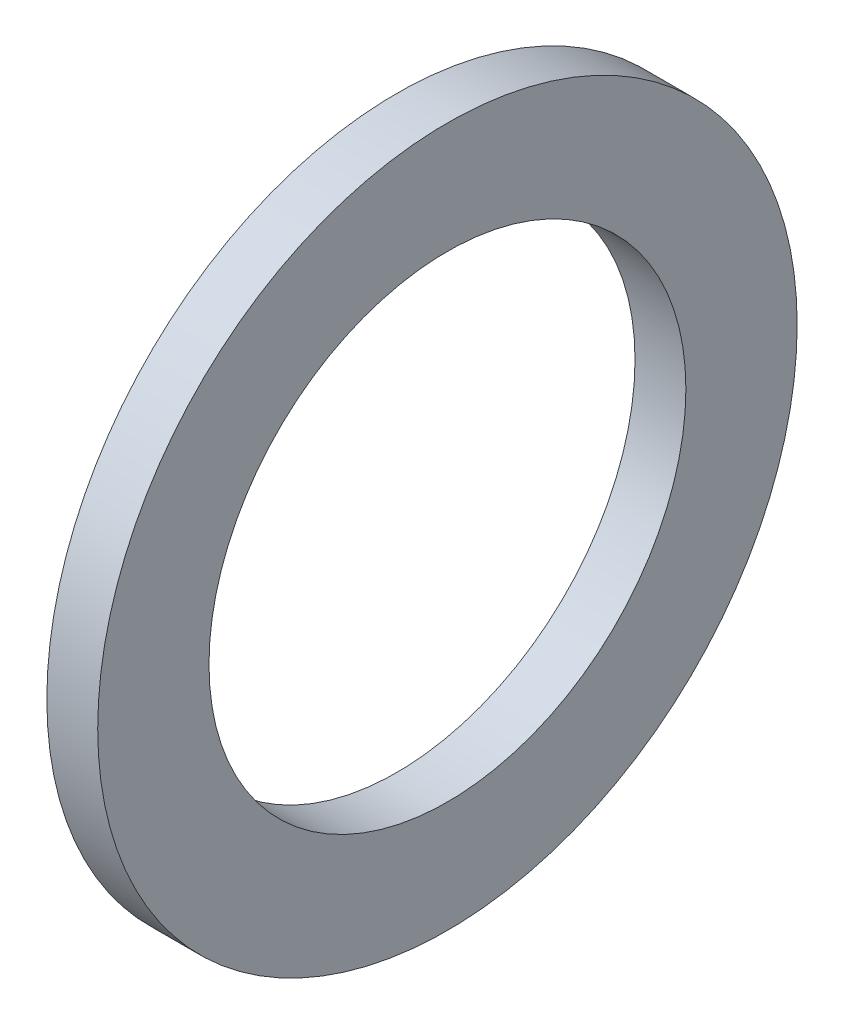
ISO-10303-21;
HEADER;
FILE_DESCRIPTION(('STEP AP214'),'2;1');
FILE_NAME('part.step','',(''),(''),'','','');
FILE_SCHEMA(('AUTOMOTIVE_DESIGN { 1 0 10303 214 1 1 1 1 }'));
ENDSEC;
DATA;
#1=APPLICATION_CONTEXT('core data for automotive mechanical design processes');
#2=APPLICATION_PROTOCOL_DEFINITION('international standard','automotive_design',2000,#1);
#3=PRODUCT_CONTEXT('',#1,'mechanical');
#4=PRODUCT('Part','Part','',(#3));
#5=PRODUCT_RELATED_PRODUCT_CATEGORY('part','',(#4));
#6=PRODUCT_DEFINITION_FORMATION('','',#4);
#7=PRODUCT_DEFINITION_CONTEXT('part definition',#1,'design');
#8=PRODUCT_DEFINITION('design','',#6,#7);
#9=PRODUCT_DEFINITION_SHAPE('','',#8);
#10=(LENGTH_UNIT() NAMED_UNIT(*) SI_UNIT(.MILLI.,.METRE.));
#11=(NAMED_UNIT(*) PLANE_ANGLE_UNIT() SI_UNIT($,.RADIAN.));
#12=(NAMED_UNIT(*) SI_UNIT($,.STERADIAN.) SOLID_ANGLE_UNIT());
#13=UNCERTAINTY_MEASURE_WITH_UNIT(LENGTH_MEASURE(1.E-05),#10,'distance_accuracy_value','');
#14=(GEOMETRIC_REPRESENTATION_CONTEXT(3) GLOBAL_UNCERTAINTY_ASSIGNED_CONTEXT((#13)) GLOBAL_UNIT_ASSIGNED_CONTEXT((#10,
#11,#12)) REPRESENTATION_CONTEXT('',''));
#15=CARTESIAN_POINT('',(0.,0.,0.));
#16=DIRECTION('',(0.,0.,1.));
#17=DIRECTION('',(1.,0.,0.));
#18=AXIS2_PLACEMENT_3D('',#15,#16,#17);
#19=CARTESIAN_POINT('',(1.6,0.,0.));
#20=DIRECTION('',(1.,0.,0.));
#21=DIRECTION('',(0.,0.,-1.));
#22=AXIS2_PLACEMENT_3D('',#19,#20,#21);
#23=PLANE('',#22);
#24=CARTESIAN_POINT('',(1.6,0.,0.));
#25=DIRECTION('',(1.,0.,0.));
#26=DIRECTION('',(0.,0.,-1.));
#27=AXIS2_PLACEMENT_3D('',#24,#25,#26);
#28=CIRCLE('',#27,11.);
#29=CARTESIAN_POINT('',(1.6,0.,-11.));
#30=VERTEX_POINT('',#29);
#31=EDGE_CURVE('E10',#30,#30,#28,.T.);
#32=ORIENTED_EDGE('',*,*,#31,.T.);
#33=EDGE_LOOP('',(#32));
#34=FACE_BOUND('',#33,.T.);
#35=CARTESIAN_POINT('',(1.6,0.,0.));
#36=DIRECTION('',(1.,0.,0.));
#37=DIRECTION('',(0.,0.,-1.));
#38=AXIS2_PLACEMENT_3D('',#35,#36,#37);
#39=CIRCLE('',#38,7.5);
#40=CARTESIAN_POINT('',(1.6,0.,-7.5));
#41=VERTEX_POINT('',#40);
#42=EDGE_CURVE('E43',#41,#41,#39,.T.);
#43=ORIENTED_EDGE('',*,*,#42,.F.);
#44=EDGE_LOOP('',(#43));
#45=FACE_BOUND('',#44,.T.);
#46=ADVANCED_FACE('F32',(#34,#45),#23,.T.);
#47=CARTESIAN_POINT('',(0.,0.,0.));
#48=DIRECTION('',(1.,0.,0.));
#49=DIRECTION('',(0.,0.,-1.));
#50=AXIS2_PLACEMENT_3D('',#47,#48,#49);
#51=PLANE('',#50);
#52=CARTESIAN_POINT('',(0.,0.,0.));
#53=DIRECTION('',(1.,0.,0.));
#54=DIRECTION('',(0.,0.,-1.));
#55=AXIS2_PLACEMENT_3D('',#52,#53,#54);
#56=CIRCLE('',#55,11.);
#57=CARTESIAN_POINT('',(0.,0.,-11.));
#58=VERTEX_POINT('',#57);
#59=EDGE_CURVE('E36',#58,#58,#56,.T.);
#60=ORIENTED_EDGE('',*,*,#59,.F.);
#61=EDGE_LOOP('',(#60));
#62=FACE_BOUND('',#61,.T.);
#63=CARTESIAN_POINT('',(0.,0.,0.));
#64=DIRECTION('',(1.,0.,0.));
#65=DIRECTION('',(0.,0.,-1.));
#66=AXIS2_PLACEMENT_3D('',#63,#64,#65);
#67=CIRCLE('',#66,7.5);
#68=CARTESIAN_POINT('',(0.,0.,-7.5));
#69=VERTEX_POINT('',#68);
#70=EDGE_CURVE('E45',#69,#69,#67,.T.);
#71=ORIENTED_EDGE('',*,*,#70,.T.);
#72=EDGE_LOOP('',(#71));
#73=FACE_BOUND('',#72,.T.);
#74=ADVANCED_FACE('F55',(#62,#73),#51,.F.);
#75=CARTESIAN_POINT('',(1.6,0.,0.));
#76=DIRECTION('',(-1.,0.,0.));
#77=DIRECTION('',(0.,0.,1.));
#78=AXIS2_PLACEMENT_3D('',#75,#76,#77);
#79=CYLINDRICAL_SURFACE('',#78,11.);
#80=ORIENTED_EDGE('',*,*,#31,.F.);
#81=EDGE_LOOP('',(#80));
#82=FACE_BOUND('',#81,.T.);
#83=ORIENTED_EDGE('',*,*,#59,.T.);
#84=EDGE_LOOP('',(#83));
#85=FACE_BOUND('',#84,.T.);
#86=ADVANCED_FACE('F34',(#82,#85),#79,.T.);
#87=CARTESIAN_POINT('',(1.6,0.,0.));
#88=DIRECTION('',(-1.,0.,0.));
#89=DIRECTION('',(0.,0.,1.));
#90=AXIS2_PLACEMENT_3D('',#87,#88,#89);
#91=CYLINDRICAL_SURFACE('',#90,7.5);
#92=ORIENTED_EDGE('',*,*,#42,.T.);
#93=EDGE_LOOP('',(#92));
#94=FACE_BOUND('',#93,.T.);
#95=ORIENTED_EDGE('',*,*,#70,.F.);
#96=EDGE_LOOP('',(#95));
#97=FACE_BOUND('',#96,.T.);
#98=ADVANCED_FACE('F51',(#94,#97),#91,.F.);
#99=CLOSED_SHELL('',(#46,#74,#86,#98));
#100=MANIFOLD_SOLID_BREP('B2',#99);
#101=ADVANCED_BREP_SHAPE_REPRESENTATION('',(#18,#100),#14);
#102=SHAPE_DEFINITION_REPRESENTATION(#9,#101);
ENDSEC;
END-ISO-10303-21;
